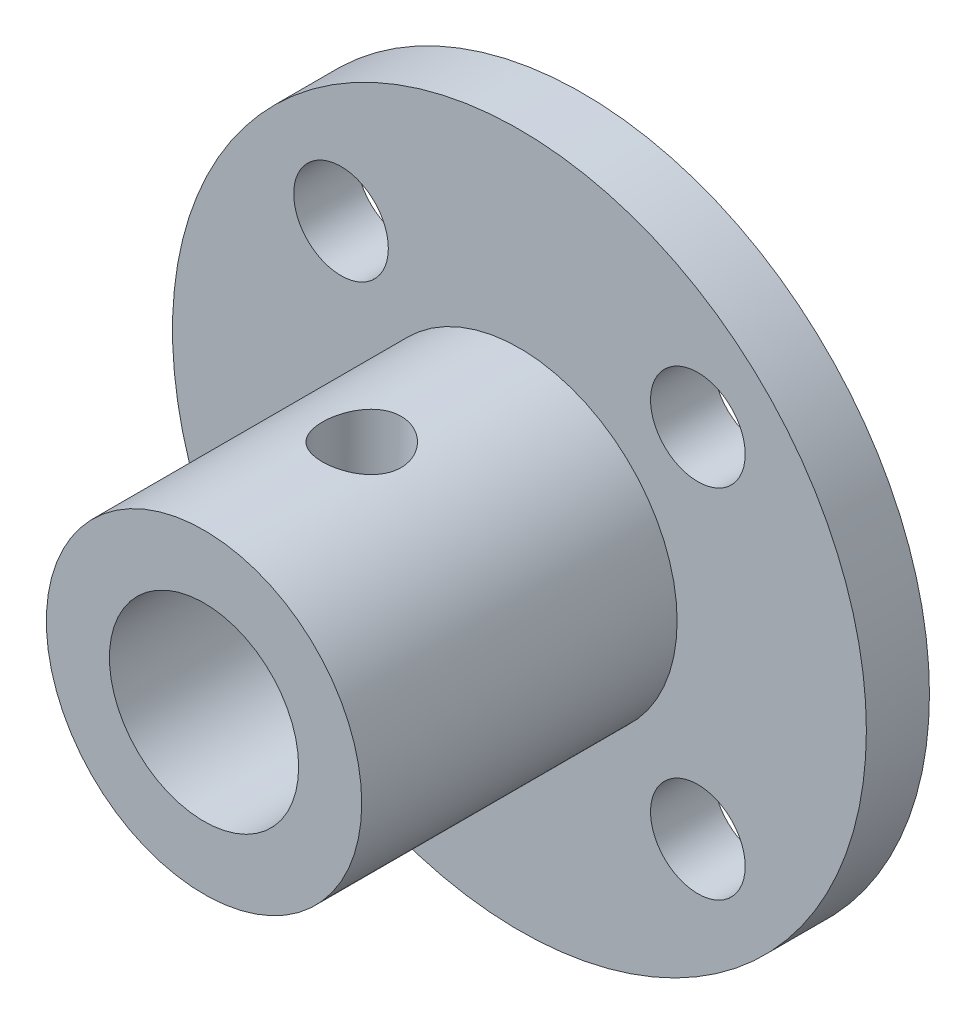
ISO-10303-21;
HEADER;
FILE_DESCRIPTION(('STEP AP214'),'2;1');
FILE_NAME('part.step','',(''),(''),'','','');
FILE_SCHEMA(('AUTOMOTIVE_DESIGN { 1 0 10303 214 1 1 1 1 }'));
ENDSEC;
DATA;
#1=APPLICATION_CONTEXT('core data for automotive mechanical design processes');
#2=APPLICATION_PROTOCOL_DEFINITION('international standard','automotive_design',2000,#1);
#3=PRODUCT_CONTEXT('',#1,'mechanical');
#4=PRODUCT('Part','Part','',(#3));
#5=PRODUCT_RELATED_PRODUCT_CATEGORY('part','',(#4));
#6=PRODUCT_DEFINITION_FORMATION('','',#4);
#7=PRODUCT_DEFINITION_CONTEXT('part definition',#1,'design');
#8=PRODUCT_DEFINITION('design','',#6,#7);
#9=PRODUCT_DEFINITION_SHAPE('','',#8);
#10=(LENGTH_UNIT() NAMED_UNIT(*) SI_UNIT(.MILLI.,.METRE.));
#11=(NAMED_UNIT(*) PLANE_ANGLE_UNIT() SI_UNIT($,.RADIAN.));
#12=(NAMED_UNIT(*) SI_UNIT($,.STERADIAN.) SOLID_ANGLE_UNIT());
#13=UNCERTAINTY_MEASURE_WITH_UNIT(LENGTH_MEASURE(1.E-05),#10,'distance_accuracy_value','');
#14=(GEOMETRIC_REPRESENTATION_CONTEXT(3) GLOBAL_UNCERTAINTY_ASSIGNED_CONTEXT((#13)) GLOBAL_UNIT_ASSIGNED_CONTEXT((#10,
#11,#12)) REPRESENTATION_CONTEXT('',''));
#15=CARTESIAN_POINT('',(0.,0.,0.));
#16=DIRECTION('',(0.,0.,1.));
#17=DIRECTION('',(1.,0.,0.));
#18=AXIS2_PLACEMENT_3D('',#15,#16,#17);
#19=CARTESIAN_POINT('',(0.,0.,2.));
#20=DIRECTION('',(0.,0.,-1.));
#21=DIRECTION('',(-1.,0.,0.));
#22=AXIS2_PLACEMENT_3D('',#19,#20,#21);
#23=CYLINDRICAL_SURFACE('',#22,11.);
#24=CARTESIAN_POINT('',(0.,0.,2.));
#25=DIRECTION('',(0.,0.,1.));
#26=DIRECTION('',(1.,0.,0.));
#27=AXIS2_PLACEMENT_3D('',#24,#25,#26);
#28=CIRCLE('',#27,11.);
#29=CARTESIAN_POINT('',(11.,0.,2.));
#30=VERTEX_POINT('',#29);
#31=EDGE_CURVE('E41',#30,#30,#28,.T.);
#32=ORIENTED_EDGE('',*,*,#31,.F.);
#33=EDGE_LOOP('',(#32));
#34=FACE_BOUND('',#33,.T.);
#35=CARTESIAN_POINT('',(0.,0.,0.));
#36=DIRECTION('',(0.,0.,1.));
#37=DIRECTION('',(1.,0.,0.));
#38=AXIS2_PLACEMENT_3D('',#35,#36,#37);
#39=CIRCLE('',#38,11.);
#40=CARTESIAN_POINT('',(11.,0.,0.));
#41=VERTEX_POINT('',#40);
#42=EDGE_CURVE('E37',#41,#41,#39,.T.);
#43=ORIENTED_EDGE('',*,*,#42,.T.);
#44=EDGE_LOOP('',(#43));
#45=FACE_BOUND('',#44,.T.);
#46=ADVANCED_FACE('F34',(#34,#45),#23,.T.);
#47=CARTESIAN_POINT('',(0.,0.,2.));
#48=DIRECTION('',(0.,0.,1.));
#49=DIRECTION('',(1.,0.,0.));
#50=AXIS2_PLACEMENT_3D('',#47,#48,#49);
#51=PLANE('',#50);
#52=CARTESIAN_POINT('',(5.65685424949238,5.65685424949238,2.));
#53=DIRECTION('',(0.,0.,1.));
#54=DIRECTION('',(1.,0.,0.));
#55=AXIS2_PLACEMENT_3D('',#52,#53,#54);
#56=CIRCLE('',#55,1.5);
#57=CARTESIAN_POINT('',(7.15685424949238,5.65685424949238,2.));
#58=VERTEX_POINT('',#57);
#59=EDGE_CURVE('E224',#58,#58,#56,.T.);
#60=ORIENTED_EDGE('',*,*,#59,.F.);
#61=EDGE_LOOP('',(#60));
#62=FACE_BOUND('',#61,.T.);
#63=CARTESIAN_POINT('',(-5.65685424949238,-5.65685424949238,2.));
#64=DIRECTION('',(0.,0.,1.));
#65=DIRECTION('',(1.,0.,0.));
#66=AXIS2_PLACEMENT_3D('',#63,#64,#65);
#67=CIRCLE('',#66,1.5);
#68=CARTESIAN_POINT('',(-4.15685424949238,-5.65685424949238,2.));
#69=VERTEX_POINT('',#68);
#70=EDGE_CURVE('E220',#69,#69,#67,.T.);
#71=ORIENTED_EDGE('',*,*,#70,.F.);
#72=EDGE_LOOP('',(#71));
#73=FACE_BOUND('',#72,.T.);
#74=CARTESIAN_POINT('',(-5.65685424949238,5.65685424949238,2.));
#75=DIRECTION('',(0.,0.,1.));
#76=DIRECTION('',(1.,0.,0.));
#77=AXIS2_PLACEMENT_3D('',#74,#75,#76);
#78=CIRCLE('',#77,1.5);
#79=CARTESIAN_POINT('',(-4.15685424949238,5.65685424949238,2.));
#80=VERTEX_POINT('',#79);
#81=EDGE_CURVE('E216',#80,#80,#78,.T.);
#82=ORIENTED_EDGE('',*,*,#81,.F.);
#83=EDGE_LOOP('',(#82));
#84=FACE_BOUND('',#83,.T.);
#85=CARTESIAN_POINT('',(5.65685424949238,-5.65685424949238,2.));
#86=DIRECTION('',(0.,0.,1.));
#87=DIRECTION('',(1.,0.,0.));
#88=AXIS2_PLACEMENT_3D('',#85,#86,#87);
#89=CIRCLE('',#88,1.5);
#90=CARTESIAN_POINT('',(7.15685424949238,-5.65685424949238,2.));
#91=VERTEX_POINT('',#90);
#92=EDGE_CURVE('E210',#91,#91,#89,.T.);
#93=ORIENTED_EDGE('',*,*,#92,.F.);
#94=EDGE_LOOP('',(#93));
#95=FACE_BOUND('',#94,.T.);
#96=CARTESIAN_POINT('',(0.,0.,2.));
#97=DIRECTION('',(0.,0.,1.));
#98=DIRECTION('',(1.,0.,0.));
#99=AXIS2_PLACEMENT_3D('',#96,#97,#98);
#100=CIRCLE('',#99,5.);
#101=CARTESIAN_POINT('',(5.,0.,2.));
#102=VERTEX_POINT('',#101);
#103=EDGE_CURVE('E10',#102,#102,#100,.T.);
#104=ORIENTED_EDGE('',*,*,#103,.F.);
#105=EDGE_LOOP('',(#104));
#106=FACE_BOUND('',#105,.T.);
#107=ORIENTED_EDGE('',*,*,#31,.T.);
#108=EDGE_LOOP('',(#107));
#109=FACE_BOUND('',#108,.T.);
#110=ADVANCED_FACE('F100',(#62,#73,#84,#95,#106,#109),#51,.T.);
#111=CARTESIAN_POINT('',(0.,0.,0.));
#112=DIRECTION('',(0.,0.,1.));
#113=DIRECTION('',(1.,0.,0.));
#114=AXIS2_PLACEMENT_3D('',#111,#112,#113);
#115=PLANE('',#114);
#116=CARTESIAN_POINT('',(5.65685424949238,5.65685424949238,0.));
#117=DIRECTION('',(0.,0.,1.));
#118=DIRECTION('',(1.,0.,0.));
#119=AXIS2_PLACEMENT_3D('',#116,#117,#118);
#120=CIRCLE('',#119,1.5);
#121=CARTESIAN_POINT('',(7.15685424949238,5.65685424949238,0.));
#122=VERTEX_POINT('',#121);
#123=EDGE_CURVE('E198',#122,#122,#120,.T.);
#124=ORIENTED_EDGE('',*,*,#123,.T.);
#125=EDGE_LOOP('',(#124));
#126=FACE_BOUND('',#125,.T.);
#127=CARTESIAN_POINT('',(-5.65685424949238,-5.65685424949238,0.));
#128=DIRECTION('',(0.,0.,1.));
#129=DIRECTION('',(1.,0.,0.));
#130=AXIS2_PLACEMENT_3D('',#127,#128,#129);
#131=CIRCLE('',#130,1.5);
#132=CARTESIAN_POINT('',(-4.15685424949238,-5.65685424949238,0.));
#133=VERTEX_POINT('',#132);
#134=EDGE_CURVE('E202',#133,#133,#131,.T.);
#135=ORIENTED_EDGE('',*,*,#134,.T.);
#136=EDGE_LOOP('',(#135));
#137=FACE_BOUND('',#136,.T.);
#138=CARTESIAN_POINT('',(-5.65685424949238,5.65685424949238,0.));
#139=DIRECTION('',(0.,0.,1.));
#140=DIRECTION('',(1.,0.,0.));
#141=AXIS2_PLACEMENT_3D('',#138,#139,#140);
#142=CIRCLE('',#141,1.5);
#143=CARTESIAN_POINT('',(-4.15685424949238,5.65685424949238,0.));
#144=VERTEX_POINT('',#143);
#145=EDGE_CURVE('E206',#144,#144,#142,.T.);
#146=ORIENTED_EDGE('',*,*,#145,.T.);
#147=EDGE_LOOP('',(#146));
#148=FACE_BOUND('',#147,.T.);
#149=CARTESIAN_POINT('',(5.65685424949238,-5.65685424949238,0.));
#150=DIRECTION('',(0.,0.,1.));
#151=DIRECTION('',(1.,0.,0.));
#152=AXIS2_PLACEMENT_3D('',#149,#150,#151);
#153=CIRCLE('',#152,1.5);
#154=CARTESIAN_POINT('',(7.15685424949238,-5.65685424949238,0.));
#155=VERTEX_POINT('',#154);
#156=EDGE_CURVE('E209',#155,#155,#153,.T.);
#157=ORIENTED_EDGE('',*,*,#156,.T.);
#158=EDGE_LOOP('',(#157));
#159=FACE_BOUND('',#158,.T.);
#160=CARTESIAN_POINT('',(0.,0.,0.));
#161=DIRECTION('',(0.,0.,1.));
#162=DIRECTION('',(1.,0.,0.));
#163=AXIS2_PLACEMENT_3D('',#160,#161,#162);
#164=CIRCLE('',#163,3.);
#165=CARTESIAN_POINT('',(3.,0.,0.));
#166=VERTEX_POINT('',#165);
#167=EDGE_CURVE('E50',#166,#166,#164,.F.);
#168=ORIENTED_EDGE('',*,*,#167,.F.);
#169=EDGE_LOOP('',(#168));
#170=FACE_BOUND('',#169,.T.);
#171=ORIENTED_EDGE('',*,*,#42,.F.);
#172=EDGE_LOOP('',(#171));
#173=FACE_BOUND('',#172,.T.);
#174=ADVANCED_FACE('F105',(#126,#137,#148,#159,#170,#173),#115,.F.);
#175=CARTESIAN_POINT('',(0.,0.,12.));
#176=DIRECTION('',(0.,0.,-1.));
#177=DIRECTION('',(-1.,0.,0.));
#178=AXIS2_PLACEMENT_3D('',#175,#176,#177);
#179=CYLINDRICAL_SURFACE('',#178,5.);
#180=CARTESIAN_POINT('',(0.,5.,5.75));
#181=CARTESIAN_POINT('',(0.0690634072247758,4.99999883223344,5.75000193811513));
#182=CARTESIAN_POINT('',(0.138148464858969,4.99855481776523,5.75574295897816));
#183=CARTESIAN_POINT('',(0.27433860314211,4.99293428191577,5.7785209594225));
#184=CARTESIAN_POINT('',(0.341442539058949,4.98875621183307,5.79556434128154));
#185=CARTESIAN_POINT('',(0.471684060152147,4.97813021943366,5.84036604455174));
#186=CARTESIAN_POINT('',(0.534826302858335,4.97168502368406,5.8681114989294));
#187=CARTESIAN_POINT('',(0.655560109920354,4.95721119839661,5.93348449170403));
#188=CARTESIAN_POINT('',(0.713151486957299,4.94918251545042,5.97111236343245));
#189=CARTESIAN_POINT('',(0.822334939417432,4.93222844659834,6.05600065804518));
#190=CARTESIAN_POINT('',(0.873796408384225,4.92328922623777,6.10342631246598));
#191=CARTESIAN_POINT('',(0.968124106002752,4.90561350097941,6.20621017075743));
#192=CARTESIAN_POINT('',(1.01098936412428,4.89687701906957,6.26156926912208));
#193=CARTESIAN_POINT('',(1.08752211899919,4.88045646416425,6.37966268894786));
#194=CARTESIAN_POINT('',(1.12104351327113,4.87278995392171,6.44249435900867));
#195=CARTESIAN_POINT('',(1.1769974237921,4.85957912343519,6.57312367638197));
#196=CARTESIAN_POINT('',(1.19943171286611,4.85403446393991,6.64092052777147));
#197=CARTESIAN_POINT('',(1.23212903067024,4.84583730597959,6.7781195818354));
#198=CARTESIAN_POINT('',(1.24262689027778,4.84312909229522,6.84746241337483));
#199=CARTESIAN_POINT('',(1.25188481255654,4.84074468781451,6.98697380751165));
#200=CARTESIAN_POINT('',(1.25064678484831,4.8410680037387,7.05714223391551));
#201=CARTESIAN_POINT('',(1.2366554371994,4.84466004580515,7.1945131731204));
#202=CARTESIAN_POINT('',(1.22418195015877,4.84785719168233,7.26174635122091));
#203=CARTESIAN_POINT('',(1.18852015575259,4.85672258063736,7.39313420909274));
#204=CARTESIAN_POINT('',(1.16533108505785,4.8623909997558,7.45728866919082));
#205=CARTESIAN_POINT('',(1.10865789828096,4.87562594920156,7.58144834687672));
#206=CARTESIAN_POINT('',(1.07507222269409,4.88321106224518,7.64140514315796));
#207=CARTESIAN_POINT('',(0.998630230012462,4.89941425705322,7.7549322581307));
#208=CARTESIAN_POINT('',(0.955772290674032,4.90803251945613,7.80850145672271));
#209=CARTESIAN_POINT('',(0.860552853901014,4.92563233783151,7.909336346412));
#210=CARTESIAN_POINT('',(0.807955215138216,4.93461724564976,7.95637874171779));
#211=CARTESIAN_POINT('',(0.695509931253082,4.95171637982321,8.04101770205325));
#212=CARTESIAN_POINT('',(0.635662064756619,4.95983057957846,8.07861397855297));
#213=CARTESIAN_POINT('',(0.510096573901159,4.97431443411819,8.14337548852032));
#214=CARTESIAN_POINT('',(0.444359494340519,4.98067800106438,8.17050445021202));
#215=CARTESIAN_POINT('',(0.309063340119068,4.99089930826182,8.21326442142464));
#216=CARTESIAN_POINT('',(0.23950499929207,4.99475752782734,8.22889763034845));
#217=CARTESIAN_POINT('',(0.100449975325022,4.99946249392812,8.24788130463237));
#218=CARTESIAN_POINT('',(0.030997266656841,5.00038377923565,8.25153585506275));
#219=CARTESIAN_POINT('',(-0.107527395667924,4.99932337345376,8.24729249828709));
#220=CARTESIAN_POINT('',(-0.176599383037162,4.99734194368205,8.23939563100072));
#221=CARTESIAN_POINT('',(-0.31134522398041,4.99074650939464,8.21252424300718));
#222=CARTESIAN_POINT('',(-0.377054265807296,4.98617195154843,8.19371561376918));
#223=CARTESIAN_POINT('',(-0.50438107704376,4.97490588861778,8.14574409664296));
#224=CARTESIAN_POINT('',(-0.565998432527195,4.9682141697491,8.11658016307236));
#225=CARTESIAN_POINT('',(-0.684602612024872,4.95327756605259,8.04813655927106));
#226=CARTESIAN_POINT('',(-0.741487868196525,4.94500722805777,8.0086865730027));
#227=CARTESIAN_POINT('',(-0.847938844702705,4.92787090989516,7.92100840933586));
#228=CARTESIAN_POINT('',(-0.897503299144172,4.91900482709754,7.87277871698591));
#229=CARTESIAN_POINT('',(-0.989158806727274,4.90140797467309,7.76749836596295));
#230=CARTESIAN_POINT('',(-1.03103655635169,4.89268586822734,7.71026024749798));
#231=CARTESIAN_POINT('',(-1.10459229917725,4.87660731981032,7.58938947127857));
#232=CARTESIAN_POINT('',(-1.13627074513161,4.86925081722522,7.52575709753354));
#233=CARTESIAN_POINT('',(-1.18829285050774,4.85681745612221,7.39424523132243));
#234=CARTESIAN_POINT('',(-1.20870366387839,4.85172712743255,7.32639364304666));
#235=CARTESIAN_POINT('',(-1.23778804996148,4.84438953408486,7.18807530175908));
#236=CARTESIAN_POINT('',(-1.24646418956555,4.84214164766613,7.11760912413959));
#237=CARTESIAN_POINT('',(-1.25169882527833,4.84079084336631,6.97823248012066));
#238=CARTESIAN_POINT('',(-1.2485982481501,4.8415994394022,6.90933547072939));
#239=CARTESIAN_POINT('',(-1.23114773192739,4.84606590839869,6.77308009277668));
#240=CARTESIAN_POINT('',(-1.21679801890564,4.84972372409881,6.70572169332196));
#241=CARTESIAN_POINT('',(-1.17744276620233,4.85942717235602,6.57482628411216));
#242=CARTESIAN_POINT('',(-1.15250117056698,4.86545846030258,6.51126891229983));
#243=CARTESIAN_POINT('',(-1.09272076133756,4.87923129770691,6.38919551440526));
#244=CARTESIAN_POINT('',(-1.05788057502849,4.88697308433977,6.3306801890109));
#245=CARTESIAN_POINT('',(-0.978223123864279,4.90354695219593,6.21870447583165));
#246=CARTESIAN_POINT('',(-0.933169302426877,4.91240220693131,6.1654157721467));
#247=CARTESIAN_POINT('',(-0.834824475991444,4.93006689371905,6.06704412933716));
#248=CARTESIAN_POINT('',(-0.781531517717619,4.93887631439216,6.02196314157253));
#249=CARTESIAN_POINT('',(-0.667056322252156,4.95564713039719,5.94049057619616));
#250=CARTESIAN_POINT('',(-0.605748685263654,4.9635902780489,5.90427115527368));
#251=CARTESIAN_POINT('',(-0.477721716258728,4.97754104145932,5.84271044754956));
#252=CARTESIAN_POINT('',(-0.411006302863948,4.98355004333151,5.81736136612622));
#253=CARTESIAN_POINT('',(-0.287008544369559,4.99206716304618,5.78202347472529));
#254=CARTESIAN_POINT('',(-0.230316809090056,4.99502154210576,5.77004063078881));
#255=CARTESIAN_POINT('',(-0.115755059613569,4.9989883769329,5.75402838031505));
#256=CARTESIAN_POINT('',(-0.0578851343688466,5.00000097875745,5.74999837557892));
#257=CARTESIAN_POINT('',(0.,5.,5.75));
#258=B_SPLINE_CURVE_WITH_KNOTS('',3,(#180,#181,#182,#183,#184,#185,#186,#187,#188,#189,#190,
#191,#192,#193,#194,#195,#196,#197,#198,#199,#200,#201,#202,#203,#204,#205,#206,#207,#208,#209,
#210,#211,#212,#213,#214,#215,#216,#217,#218,#219,#220,#221,#222,#223,#224,#225,#226,#227,#228,
#229,#230,#231,#232,#233,#234,#235,#236,#237,#238,#239,#240,#241,#242,#243,#244,#245,#246,#247,
#248,#249,#250,#251,#252,#253,#254,#255,#256,#257),.UNSPECIFIED.,.T.,.F.,(4,2,2,2,2,2,2,2,2,2,2,
2,2,2,2,2,2,2,2,2,2,2,2,2,2,2,2,2,2,2,2,2,2,2,2,2,2,2,4),(0.,0.206978093726575,
0.414073531469916,0.620920751905087,0.827774950141106,1.03845362864282,1.24915607983385,
1.46298872954839,1.6767871764114,1.88630245916192,2.09578365093914,2.30018747505848,
2.50460586221699,2.71108773228232,2.91760575696802,3.13001250807516,3.34242574631872,
3.55556857507595,3.76867061407202,3.97631924124396,4.18394917593952,4.38850228761697,
4.59307606101908,4.80127989637793,5.00951969173349,5.22287091003729,5.4362126562459,
5.6482687884503,5.86027852710339,6.06619816998843,6.27211367463361,6.47680333799539,
6.68152140114084,6.89157980341591,7.10168808142014,7.31560154582989,7.52936136517791,
7.7028520245179,7.87632963369199),.UNSPECIFIED.);
#259=CARTESIAN_POINT('',(0.,5.,5.75));
#260=VERTEX_POINT('',#259);
#261=EDGE_CURVE('E64',#260,#260,#258,.T.);
#262=ORIENTED_EDGE('',*,*,#261,.T.);
#263=EDGE_LOOP('',(#262));
#264=FACE_BOUND('',#263,.T.);
#265=CARTESIAN_POINT('',(0.,0.,12.));
#266=DIRECTION('',(0.,0.,1.));
#267=DIRECTION('',(1.,0.,0.));
#268=AXIS2_PLACEMENT_3D('',#265,#266,#267);
#269=CIRCLE('',#268,5.);
#270=CARTESIAN_POINT('',(5.,0.,12.));
#271=VERTEX_POINT('',#270);
#272=EDGE_CURVE('E47',#271,#271,#269,.T.);
#273=ORIENTED_EDGE('',*,*,#272,.F.);
#274=EDGE_LOOP('',(#273));
#275=FACE_BOUND('',#274,.T.);
#276=ORIENTED_EDGE('',*,*,#103,.T.);
#277=EDGE_LOOP('',(#276));
#278=FACE_BOUND('',#277,.T.);
#279=ADVANCED_FACE('F114',(#264,#275,#278),#179,.T.);
#280=CARTESIAN_POINT('',(0.,0.,12.));
#281=DIRECTION('',(0.,0.,1.));
#282=DIRECTION('',(1.,0.,0.));
#283=AXIS2_PLACEMENT_3D('',#280,#281,#282);
#284=PLANE('',#283);
#285=CARTESIAN_POINT('',(0.,0.,12.));
#286=DIRECTION('',(0.,0.,1.));
#287=DIRECTION('',(1.,0.,0.));
#288=AXIS2_PLACEMENT_3D('',#285,#286,#287);
#289=CIRCLE('',#288,3.);
#290=CARTESIAN_POINT('',(3.,0.,12.));
#291=VERTEX_POINT('',#290);
#292=EDGE_CURVE('E53',#291,#291,#289,.T.);
#293=ORIENTED_EDGE('',*,*,#292,.F.);
#294=EDGE_LOOP('',(#293));
#295=FACE_BOUND('',#294,.T.);
#296=ORIENTED_EDGE('',*,*,#272,.T.);
#297=EDGE_LOOP('',(#296));
#298=FACE_BOUND('',#297,.T.);
#299=ADVANCED_FACE('F119',(#295,#298),#284,.T.);
#300=CARTESIAN_POINT('',(0.,0.,-0.000999999999999265));
#301=DIRECTION('',(0.,0.,1.));
#302=DIRECTION('',(1.,0.,0.));
#303=AXIS2_PLACEMENT_3D('',#300,#301,#302);
#304=CYLINDRICAL_SURFACE('',#303,3.);
#305=CARTESIAN_POINT('',(0.,3.,5.75));
#306=CARTESIAN_POINT('',(-0.0669580526362669,2.99999458367273,5.7500072050913));
#307=CARTESIAN_POINT('',(-0.134021397063841,2.9977323297471,5.75541195852814));
#308=CARTESIAN_POINT('',(-0.266247371156347,2.98890153579552,5.77683906492018));
#309=CARTESIAN_POINT('',(-0.331404576423564,2.98232175901028,5.79288912446425));
#310=CARTESIAN_POINT('',(-0.457688733653088,2.96556289038127,5.83491109178059));
#311=CARTESIAN_POINT('',(-0.518828524426269,2.95539599975004,5.86084938946815));
#312=CARTESIAN_POINT('',(-0.635829756679802,2.93245286470664,5.92177282323257));
#313=CARTESIAN_POINT('',(-0.691692790015939,2.91967741092849,5.95675521897087));
#314=CARTESIAN_POINT('',(-0.799448403559512,2.89207828351869,6.03662898259088));
#315=CARTESIAN_POINT('',(-0.851041267517768,2.87718753326093,6.08190130878975));
#316=CARTESIAN_POINT('',(-0.946159821091262,2.84732714068514,6.18026433478257));
#317=CARTESIAN_POINT('',(-0.989681263153085,2.83235746106809,6.23335912489451));
#318=CARTESIAN_POINT('',(-1.06953737697065,2.80321021812995,6.3490267775649));
#319=CARTESIAN_POINT('',(-1.10541308153925,2.78910786873385,6.41193744842654));
#320=CARTESIAN_POINT('',(-1.16593940588866,2.76435572357005,6.54357325792093));
#321=CARTESIAN_POINT('',(-1.19059580836291,2.75370415000823,6.61229537948445));
#322=CARTESIAN_POINT('',(-1.22674598312159,2.73778555387705,6.75015369176792));
#323=CARTESIAN_POINT('',(-1.23881657877606,2.73228387651787,6.81911048339215));
#324=CARTESIAN_POINT('',(-1.25125209967796,2.72661326219504,6.95827329268657));
#325=CARTESIAN_POINT('',(-1.25162348054397,2.7264413842526,7.02847860002574));
#326=CARTESIAN_POINT('',(-1.24108450363674,2.73125119560853,7.16240006043494));
#327=CARTESIAN_POINT('',(-1.23103681112301,2.73583882723623,7.22620109656446));
#328=CARTESIAN_POINT('',(-1.20139191015777,2.74898482773796,7.35111209100039));
#329=CARTESIAN_POINT('',(-1.18179287287177,2.75754395703564,7.41222153149177));
#330=CARTESIAN_POINT('',(-1.13321958727571,2.77786184772756,7.53155770299144));
#331=CARTESIAN_POINT('',(-1.10405471539236,2.78968481949136,7.58969542091338));
#332=CARTESIAN_POINT('',(-1.03731242580562,2.81518331141086,7.70047773388015));
#333=CARTESIAN_POINT('',(-0.999731690519544,2.82885956129779,7.75312015061352));
#334=CARTESIAN_POINT('',(-0.913495965543836,2.85792976877979,7.85609995873284));
#335=CARTESIAN_POINT('',(-0.864173483207527,2.87337121404473,7.90586656738544));
#336=CARTESIAN_POINT('',(-0.757729591051512,2.90325673112529,7.99661350295918));
#337=CARTESIAN_POINT('',(-0.700606359448457,2.9177005687701,8.03759177169218));
#338=CARTESIAN_POINT('',(-0.578447948693376,2.94438283556473,8.11043582361627));
#339=CARTESIAN_POINT('',(-0.51326058244768,2.95656266543334,8.14206944515068));
#340=CARTESIAN_POINT('',(-0.377852402526832,2.97689481414803,8.19372113960326));
#341=CARTESIAN_POINT('',(-0.307634394795035,2.985049358458,8.21374563194382));
#342=CARTESIAN_POINT('',(-0.168928113346229,2.99599641186385,8.24041599212664));
#343=CARTESIAN_POINT('',(-0.10061128527864,2.99909541047125,8.24782785744375));
#344=CARTESIAN_POINT('',(0.0363546554960885,3.00056050368745,8.25134622361409));
#345=CARTESIAN_POINT('',(0.105003667152635,2.99892795711939,8.247455970252));
#346=CARTESIAN_POINT('',(0.237098242341435,2.9913121765694,8.22902891519393));
#347=CARTESIAN_POINT('',(0.300632966639387,2.9855488728399,8.2150300459028));
#348=CARTESIAN_POINT('',(0.424382748971091,2.97048606772414,8.17753180545922));
#349=CARTESIAN_POINT('',(0.484597386518361,2.96118611959704,8.1540312340497));
#350=CARTESIAN_POINT('',(0.602108999869136,2.93958270645166,8.09742902428788));
#351=CARTESIAN_POINT('',(0.659257236855323,2.92719491469281,8.06405181685396));
#352=CARTESIAN_POINT('',(0.767346216231429,2.9007380457909,7.9889466222083));
#353=CARTESIAN_POINT('',(0.818284352601941,2.88666826768733,7.94721514847073));
#354=CARTESIAN_POINT('',(0.916333430274264,2.85712087895438,7.85309676672759));
#355=CARTESIAN_POINT('',(0.962910697979835,2.84161451591029,7.80016149701374));
#356=CARTESIAN_POINT('',(1.04666984610551,2.81184336768005,7.68697872406461));
#357=CARTESIAN_POINT('',(1.08384959285617,2.79757886493438,7.62672956482827));
#358=CARTESIAN_POINT('',(1.14815960208699,2.77181386243988,7.49938582469742));
#359=CARTESIAN_POINT('',(1.17513918237329,2.76035562555112,7.43220596448517));
#360=CARTESIAN_POINT('',(1.21717413951573,2.74208355658957,7.29362940618989));
#361=CARTESIAN_POINT('',(1.23223934863688,2.73526589555752,7.22223623751665));
#362=CARTESIAN_POINT('',(1.24904080348901,2.72763164537264,7.08318130080079));
#363=CARTESIAN_POINT('',(1.25171380413129,2.72639350967163,7.01565533770739));
#364=CARTESIAN_POINT('',(1.24615575523912,2.72893853011024,6.8811571388589));
#365=CARTESIAN_POINT('',(1.23792637964721,2.73272091540306,6.81418481968631));
#366=CARTESIAN_POINT('',(1.21158404780491,2.74449551302268,6.68590725253111));
#367=CARTESIAN_POINT('',(1.19394903571466,2.7522835484648,6.62448332653661));
#368=CARTESIAN_POINT('',(1.14976328202134,2.77103181199189,6.50545197864277));
#369=CARTESIAN_POINT('',(1.12321003517252,2.78199293131693,6.44784563460122));
#370=CARTESIAN_POINT('',(1.0601028593549,2.80666954560013,6.33430410405088));
#371=CARTESIAN_POINT('',(1.02304360910483,2.82051102713679,6.27867766983171));
#372=CARTESIAN_POINT('',(0.940684072630391,2.84903689053839,6.17413986063932));
#373=CARTESIAN_POINT('',(0.895380928905619,2.86372156345875,6.12523082439943));
#374=CARTESIAN_POINT('',(0.793902045778821,2.89356392850106,6.03185131831526));
#375=CARTESIAN_POINT('',(0.737174739949028,2.90867817511792,5.98796356715935));
#376=CARTESIAN_POINT('',(0.616600079253199,2.9366014362202,5.91030054645637));
#377=CARTESIAN_POINT('',(0.552749497945746,2.9494093991674,5.87652988511045));
#378=CARTESIAN_POINT('',(0.42073205671795,2.97109183362461,5.82079015456012));
#379=CARTESIAN_POINT('',(0.352653990980635,2.98002782581964,5.7986352333827));
#380=CARTESIAN_POINT('',(0.213410421846558,2.99321009768625,5.76629367092217));
#381=CARTESIAN_POINT('',(0.142255316980957,2.99747105811967,5.75606955747012));
#382=CARTESIAN_POINT('',(0.0472360819191833,2.99972287568934,5.75066683891355));
#383=CARTESIAN_POINT('',(0.0236245946756571,3.00000191102536,5.74999745785078));
#384=CARTESIAN_POINT('',(0.,3.,5.75));
#385=B_SPLINE_CURVE_WITH_KNOTS('',3,(#305,#306,#307,#308,#309,#310,#311,#312,#313,#314,#315,
#316,#317,#318,#319,#320,#321,#322,#323,#324,#325,#326,#327,#328,#329,#330,#331,#332,#333,#334,
#335,#336,#337,#338,#339,#340,#341,#342,#343,#344,#345,#346,#347,#348,#349,#350,#351,#352,#353,
#354,#355,#356,#357,#358,#359,#360,#361,#362,#363,#364,#365,#366,#367,#368,#369,#370,#371,#372,
#373,#374,#375,#376,#377,#378,#379,#380,#381,#382,#383,#384),.UNSPECIFIED.,.T.,.F.,(4,2,2,2,2,2,
2,2,2,2,2,2,2,2,2,2,2,2,2,2,2,2,2,2,2,2,2,2,2,2,2,2,2,2,2,2,2,2,2,4),(0.,0.200806918883939,
0.402138540628696,0.602791851906301,0.803384436852974,1.01317936288807,1.22308438131465,
1.44331724539125,1.66343646730588,1.87295273137558,2.08235338249046,2.27570157202556,
2.46908679727212,2.66658713058714,2.86416545717206,3.07844141127896,3.29276749314588,
3.51204055060813,3.73119224218297,3.93648443393251,4.14171767493172,4.33676589735721,
4.53183876601785,4.73297135272161,4.93418805469496,5.14978488029294,5.36543061240341,
5.58414788359524,5.80268447074581,6.00439877559644,6.20608211297536,6.39837649964763,
6.59072494950613,6.79463893397441,6.99862373425944,7.21746535004889,7.43640649428582,
7.65172855819385,7.86637250469321,7.93722256499098),.UNSPECIFIED.);
#386=CARTESIAN_POINT('',(0.,3.,5.75));
#387=VERTEX_POINT('',#386);
#388=EDGE_CURVE('E56',#387,#387,#385,.T.);
#389=ORIENTED_EDGE('',*,*,#388,.T.);
#390=EDGE_LOOP('',(#389));
#391=FACE_BOUND('',#390,.T.);
#392=ORIENTED_EDGE('',*,*,#292,.T.);
#393=EDGE_LOOP('',(#392));
#394=FACE_BOUND('',#393,.T.);
#395=ORIENTED_EDGE('',*,*,#167,.T.);
#396=EDGE_LOOP('',(#395));
#397=FACE_BOUND('',#396,.T.);
#398=ADVANCED_FACE('F70',(#391,#394,#397),#304,.F.);
#399=CARTESIAN_POINT('',(0.,0.,7.));
#400=DIRECTION('',(0.,-1.,0.));
#401=DIRECTION('',(0.,0.,-1.));
#402=AXIS2_PLACEMENT_3D('',#399,#400,#401);
#403=CYLINDRICAL_SURFACE('',#402,1.25);
#404=ORIENTED_EDGE('',*,*,#261,.F.);
#405=EDGE_LOOP('',(#404));
#406=FACE_BOUND('',#405,.T.);
#407=ORIENTED_EDGE('',*,*,#388,.F.);
#408=EDGE_LOOP('',(#407));
#409=FACE_BOUND('',#408,.T.);
#410=ADVANCED_FACE('F73',(#406,#409),#403,.F.);
#411=CARTESIAN_POINT('',(5.65685424949238,-5.65685424949238,2.));
#412=DIRECTION('',(0.,0.,1.));
#413=DIRECTION('',(1.,0.,0.));
#414=AXIS2_PLACEMENT_3D('',#411,#412,#413);
#415=CYLINDRICAL_SURFACE('',#414,1.5);
#416=ORIENTED_EDGE('',*,*,#156,.F.);
#417=EDGE_LOOP('',(#416));
#418=FACE_BOUND('',#417,.T.);
#419=ORIENTED_EDGE('',*,*,#92,.T.);
#420=EDGE_LOOP('',(#419));
#421=FACE_BOUND('',#420,.T.);
#422=ADVANCED_FACE('F77',(#418,#421),#415,.F.);
#423=CARTESIAN_POINT('',(-5.65685424949238,5.65685424949238,2.));
#424=DIRECTION('',(0.,0.,1.));
#425=DIRECTION('',(1.,0.,0.));
#426=AXIS2_PLACEMENT_3D('',#423,#424,#425);
#427=CYLINDRICAL_SURFACE('',#426,1.5);
#428=ORIENTED_EDGE('',*,*,#145,.F.);
#429=EDGE_LOOP('',(#428));
#430=FACE_BOUND('',#429,.T.);
#431=ORIENTED_EDGE('',*,*,#81,.T.);
#432=EDGE_LOOP('',(#431));
#433=FACE_BOUND('',#432,.T.);
#434=ADVANCED_FACE('F83',(#430,#433),#427,.F.);
#435=CARTESIAN_POINT('',(-5.65685424949238,-5.65685424949238,2.));
#436=DIRECTION('',(0.,0.,1.));
#437=DIRECTION('',(1.,0.,0.));
#438=AXIS2_PLACEMENT_3D('',#435,#436,#437);
#439=CYLINDRICAL_SURFACE('',#438,1.5);
#440=ORIENTED_EDGE('',*,*,#134,.F.);
#441=EDGE_LOOP('',(#440));
#442=FACE_BOUND('',#441,.T.);
#443=ORIENTED_EDGE('',*,*,#70,.T.);
#444=EDGE_LOOP('',(#443));
#445=FACE_BOUND('',#444,.T.);
#446=ADVANCED_FACE('F87',(#442,#445),#439,.F.);
#447=CARTESIAN_POINT('',(5.65685424949238,5.65685424949238,2.));
#448=DIRECTION('',(0.,0.,1.));
#449=DIRECTION('',(1.,0.,0.));
#450=AXIS2_PLACEMENT_3D('',#447,#448,#449);
#451=CYLINDRICAL_SURFACE('',#450,1.5);
#452=ORIENTED_EDGE('',*,*,#123,.F.);
#453=EDGE_LOOP('',(#452));
#454=FACE_BOUND('',#453,.T.);
#455=ORIENTED_EDGE('',*,*,#59,.T.);
#456=EDGE_LOOP('',(#455));
#457=FACE_BOUND('',#456,.T.);
#458=ADVANCED_FACE('F91',(#454,#457),#451,.F.);
#459=CLOSED_SHELL('',(#46,#110,#174,#279,#299,#398,#410,#422,#434,#446,#458));
#460=MANIFOLD_SOLID_BREP('B2',#459);
#461=ADVANCED_BREP_SHAPE_REPRESENTATION('',(#18,#460),#14);
#462=SHAPE_DEFINITION_REPRESENTATION(#9,#461);
ENDSEC;
END-ISO-10303-21;
